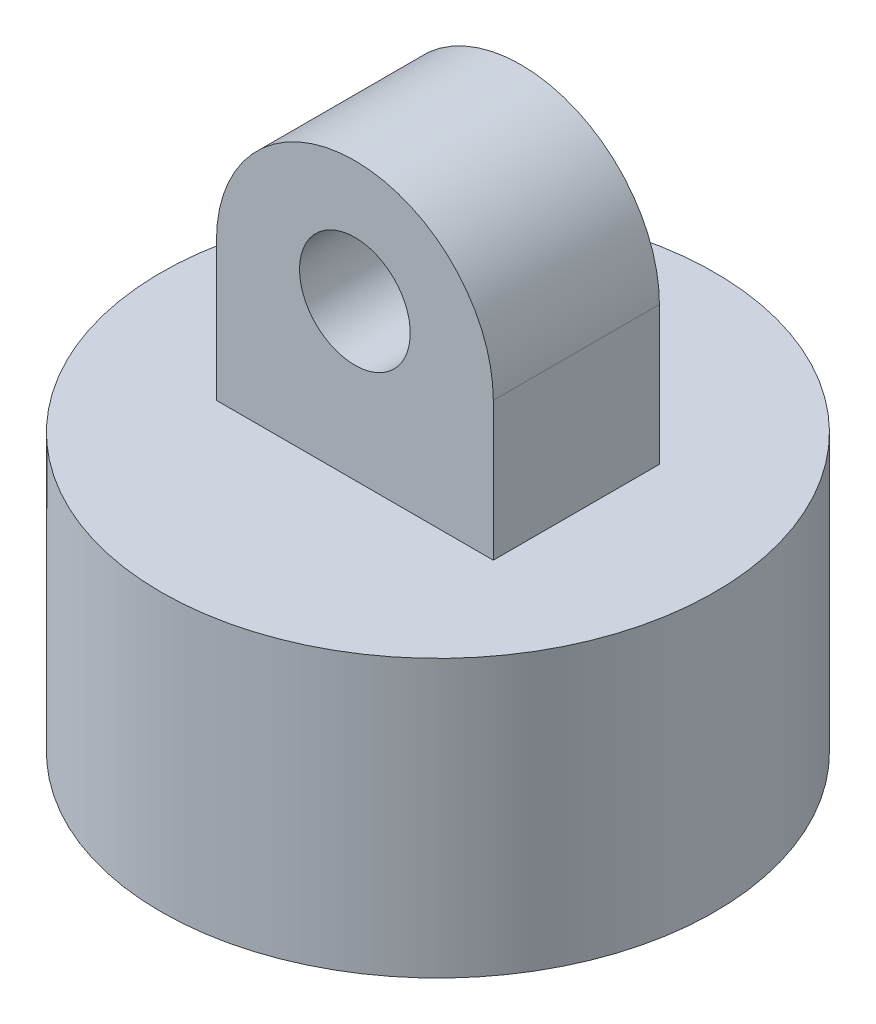
ISO-10303-21;
HEADER;
FILE_DESCRIPTION(('STEP AP214'),'2;1');
FILE_NAME('part.step','',(''),(''),'','','');
FILE_SCHEMA(('AUTOMOTIVE_DESIGN { 1 0 10303 214 1 1 1 1 }'));
ENDSEC;
DATA;
#1=APPLICATION_CONTEXT('core data for automotive mechanical design processes');
#2=APPLICATION_PROTOCOL_DEFINITION('international standard','automotive_design',2000,#1);
#3=PRODUCT_CONTEXT('',#1,'mechanical');
#4=PRODUCT('Part','Part','',(#3));
#5=PRODUCT_RELATED_PRODUCT_CATEGORY('part','',(#4));
#6=PRODUCT_DEFINITION_FORMATION('','',#4);
#7=PRODUCT_DEFINITION_CONTEXT('part definition',#1,'design');
#8=PRODUCT_DEFINITION('design','',#6,#7);
#9=PRODUCT_DEFINITION_SHAPE('','',#8);
#10=(LENGTH_UNIT() NAMED_UNIT(*) SI_UNIT(.MILLI.,.METRE.));
#11=(NAMED_UNIT(*) PLANE_ANGLE_UNIT() SI_UNIT($,.RADIAN.));
#12=(NAMED_UNIT(*) SI_UNIT($,.STERADIAN.) SOLID_ANGLE_UNIT());
#13=UNCERTAINTY_MEASURE_WITH_UNIT(LENGTH_MEASURE(1.E-05),#10,'distance_accuracy_value','');
#14=(GEOMETRIC_REPRESENTATION_CONTEXT(3) GLOBAL_UNCERTAINTY_ASSIGNED_CONTEXT((#13)) GLOBAL_UNIT_ASSIGNED_CONTEXT((#10,
#11,#12)) REPRESENTATION_CONTEXT('',''));
#15=CARTESIAN_POINT('',(0.,0.,0.));
#16=DIRECTION('',(0.,0.,1.));
#17=DIRECTION('',(1.,0.,0.));
#18=AXIS2_PLACEMENT_3D('',#15,#16,#17);
#19=CARTESIAN_POINT('',(0.,75.,15.));
#20=DIRECTION('',(0.,0.,1.));
#21=DIRECTION('',(1.,0.,0.));
#22=AXIS2_PLACEMENT_3D('',#19,#20,#21);
#23=CYLINDRICAL_SURFACE('',#22,25.);
#24=DIRECTION('',(0.,0.,-1.));
#25=VECTOR('',#24,1.);
#26=CARTESIAN_POINT('',(-25.,75.,15.));
#27=LINE('',#26,#25);
#28=CARTESIAN_POINT('',(-25.,75.,15.));
#29=VERTEX_POINT('',#28);
#30=CARTESIAN_POINT('',(-25.,75.,-15.));
#31=VERTEX_POINT('',#30);
#32=EDGE_CURVE('E128',#29,#31,#27,.T.);
#33=ORIENTED_EDGE('',*,*,#32,.F.);
#34=CARTESIAN_POINT('',(0.,75.,15.));
#35=DIRECTION('',(0.,0.,-1.));
#36=DIRECTION('',(-1.,0.,0.));
#37=AXIS2_PLACEMENT_3D('',#34,#35,#36);
#38=CIRCLE('',#37,25.);
#39=CARTESIAN_POINT('',(25.,75.,15.));
#40=VERTEX_POINT('',#39);
#41=EDGE_CURVE('E50',#40,#29,#38,.F.);
#42=ORIENTED_EDGE('',*,*,#41,.F.);
#43=DIRECTION('',(0.,0.,-1.));
#44=VECTOR('',#43,1.);
#45=CARTESIAN_POINT('',(25.,75.,15.));
#46=LINE('',#45,#44);
#47=CARTESIAN_POINT('',(25.,75.,-15.));
#48=VERTEX_POINT('',#47);
#49=EDGE_CURVE('E85',#48,#40,#46,.F.);
#50=ORIENTED_EDGE('',*,*,#49,.F.);
#51=CARTESIAN_POINT('',(0.,75.,-15.));
#52=DIRECTION('',(0.,0.,1.));
#53=DIRECTION('',(1.,0.,0.));
#54=AXIS2_PLACEMENT_3D('',#51,#52,#53);
#55=CIRCLE('',#54,25.);
#56=EDGE_CURVE('E11',#31,#48,#55,.F.);
#57=ORIENTED_EDGE('',*,*,#56,.F.);
#58=EDGE_LOOP('',(#33,#42,#50,#57));
#59=FACE_BOUND('',#58,.T.);
#60=ADVANCED_FACE('F41',(#59),#23,.T.);
#61=CARTESIAN_POINT('',(0.,50.,0.));
#62=DIRECTION('',(0.,-1.,0.));
#63=DIRECTION('',(0.,0.,-1.));
#64=AXIS2_PLACEMENT_3D('',#61,#62,#63);
#65=CYLINDRICAL_SURFACE('',#64,50.);
#66=CARTESIAN_POINT('',(0.,50.,0.));
#67=DIRECTION('',(0.,1.,0.));
#68=DIRECTION('',(0.,0.,1.));
#69=AXIS2_PLACEMENT_3D('',#66,#67,#68);
#70=CIRCLE('',#69,50.);
#71=CARTESIAN_POINT('',(0.,50.,50.));
#72=VERTEX_POINT('',#71);
#73=EDGE_CURVE('E124',#72,#72,#70,.T.);
#74=ORIENTED_EDGE('',*,*,#73,.F.);
#75=EDGE_LOOP('',(#74));
#76=FACE_BOUND('',#75,.T.);
#77=CARTESIAN_POINT('',(0.,0.,0.));
#78=DIRECTION('',(0.,1.,0.));
#79=DIRECTION('',(0.,0.,1.));
#80=AXIS2_PLACEMENT_3D('',#77,#78,#79);
#81=CIRCLE('',#80,50.);
#82=CARTESIAN_POINT('',(0.,0.,50.));
#83=VERTEX_POINT('',#82);
#84=EDGE_CURVE('E123',#83,#83,#81,.T.);
#85=ORIENTED_EDGE('',*,*,#84,.T.);
#86=EDGE_LOOP('',(#85));
#87=FACE_BOUND('',#86,.T.);
#88=ADVANCED_FACE('F153',(#76,#87),#65,.T.);
#89=CARTESIAN_POINT('',(0.,50.,0.));
#90=DIRECTION('',(0.,1.,0.));
#91=DIRECTION('',(0.,0.,1.));
#92=AXIS2_PLACEMENT_3D('',#89,#90,#91);
#93=PLANE('',#92);
#94=DIRECTION('',(0.,0.,1.));
#95=VECTOR('',#94,1.);
#96=CARTESIAN_POINT('',(-25.,50.,-15.));
#97=LINE('',#96,#95);
#98=CARTESIAN_POINT('',(-25.,50.,-15.));
#99=VERTEX_POINT('',#98);
#100=CARTESIAN_POINT('',(-25.,50.,15.));
#101=VERTEX_POINT('',#100);
#102=EDGE_CURVE('E107',#99,#101,#97,.T.);
#103=ORIENTED_EDGE('',*,*,#102,.F.);
#104=DIRECTION('',(-1.,0.,0.));
#105=VECTOR('',#104,1.);
#106=CARTESIAN_POINT('',(-25.,50.,-15.));
#107=LINE('',#106,#105);
#108=CARTESIAN_POINT('',(25.,50.,-15.));
#109=VERTEX_POINT('',#108);
#110=EDGE_CURVE('E101',#109,#99,#107,.T.);
#111=ORIENTED_EDGE('',*,*,#110,.F.);
#112=DIRECTION('',(0.,0.,-1.));
#113=VECTOR('',#112,1.);
#114=CARTESIAN_POINT('',(25.,50.,-15.));
#115=LINE('',#114,#113);
#116=CARTESIAN_POINT('',(25.,50.,15.));
#117=VERTEX_POINT('',#116);
#118=EDGE_CURVE('E84',#117,#109,#115,.T.);
#119=ORIENTED_EDGE('',*,*,#118,.F.);
#120=DIRECTION('',(1.,0.,0.));
#121=VECTOR('',#120,1.);
#122=CARTESIAN_POINT('',(-25.,50.,15.));
#123=LINE('',#122,#121);
#124=EDGE_CURVE('E98',#101,#117,#123,.T.);
#125=ORIENTED_EDGE('',*,*,#124,.F.);
#126=EDGE_LOOP('',(#103,#111,#119,#125));
#127=FACE_BOUND('',#126,.T.);
#128=ORIENTED_EDGE('',*,*,#73,.T.);
#129=EDGE_LOOP('',(#128));
#130=FACE_BOUND('',#129,.T.);
#131=ADVANCED_FACE('F96',(#127,#130),#93,.T.);
#132=CARTESIAN_POINT('',(0.,0.,0.));
#133=DIRECTION('',(0.,1.,0.));
#134=DIRECTION('',(0.,0.,1.));
#135=AXIS2_PLACEMENT_3D('',#132,#133,#134);
#136=PLANE('',#135);
#137=ORIENTED_EDGE('',*,*,#84,.F.);
#138=EDGE_LOOP('',(#137));
#139=FACE_BOUND('',#138,.T.);
#140=ADVANCED_FACE('F161',(#139),#136,.F.);
#141=CARTESIAN_POINT('',(-25.,100.,-15.));
#142=DIRECTION('',(1.,0.,0.));
#143=DIRECTION('',(0.,0.,-1.));
#144=AXIS2_PLACEMENT_3D('',#141,#142,#143);
#145=PLANE('',#144);
#146=DIRECTION('',(0.,-1.,0.));
#147=VECTOR('',#146,1.);
#148=CARTESIAN_POINT('',(-25.,100.,15.));
#149=LINE('',#148,#147);
#150=EDGE_CURVE('E89',#29,#101,#149,.T.);
#151=ORIENTED_EDGE('',*,*,#150,.F.);
#152=ORIENTED_EDGE('',*,*,#32,.T.);
#153=DIRECTION('',(0.,-1.,0.));
#154=VECTOR('',#153,1.);
#155=CARTESIAN_POINT('',(-25.,100.,-15.));
#156=LINE('',#155,#154);
#157=EDGE_CURVE('E116',#31,#99,#156,.T.);
#158=ORIENTED_EDGE('',*,*,#157,.T.);
#159=ORIENTED_EDGE('',*,*,#102,.T.);
#160=EDGE_LOOP('',(#151,#152,#158,#159));
#161=FACE_BOUND('',#160,.T.);
#162=ADVANCED_FACE('F138',(#161),#145,.F.);
#163=CARTESIAN_POINT('',(-25.,100.,15.));
#164=DIRECTION('',(0.,0.,-1.));
#165=DIRECTION('',(-1.,0.,0.));
#166=AXIS2_PLACEMENT_3D('',#163,#164,#165);
#167=PLANE('',#166);
#168=CARTESIAN_POINT('',(0.,78.,15.));
#169=DIRECTION('',(0.,0.,-1.));
#170=DIRECTION('',(-1.,0.,0.));
#171=AXIS2_PLACEMENT_3D('',#168,#169,#170);
#172=CIRCLE('',#171,10.);
#173=CARTESIAN_POINT('',(-10.,78.,15.));
#174=VERTEX_POINT('',#173);
#175=EDGE_CURVE('E110',#174,#174,#172,.T.);
#176=ORIENTED_EDGE('',*,*,#175,.T.);
#177=EDGE_LOOP('',(#176));
#178=FACE_BOUND('',#177,.T.);
#179=DIRECTION('',(0.,-1.,0.));
#180=VECTOR('',#179,1.);
#181=CARTESIAN_POINT('',(25.,100.,15.));
#182=LINE('',#181,#180);
#183=EDGE_CURVE('E80',#40,#117,#182,.T.);
#184=ORIENTED_EDGE('',*,*,#183,.F.);
#185=ORIENTED_EDGE('',*,*,#41,.T.);
#186=ORIENTED_EDGE('',*,*,#150,.T.);
#187=ORIENTED_EDGE('',*,*,#124,.T.);
#188=EDGE_LOOP('',(#184,#185,#186,#187));
#189=FACE_BOUND('',#188,.T.);
#190=ADVANCED_FACE('F104',(#178,#189),#167,.F.);
#191=CARTESIAN_POINT('',(25.,100.,-15.));
#192=DIRECTION('',(-1.,0.,0.));
#193=DIRECTION('',(0.,0.,1.));
#194=AXIS2_PLACEMENT_3D('',#191,#192,#193);
#195=PLANE('',#194);
#196=DIRECTION('',(0.,-1.,0.));
#197=VECTOR('',#196,1.);
#198=CARTESIAN_POINT('',(25.,100.,-15.));
#199=LINE('',#198,#197);
#200=EDGE_CURVE('E90',#48,#109,#199,.T.);
#201=ORIENTED_EDGE('',*,*,#200,.F.);
#202=ORIENTED_EDGE('',*,*,#49,.T.);
#203=ORIENTED_EDGE('',*,*,#183,.T.);
#204=ORIENTED_EDGE('',*,*,#118,.T.);
#205=EDGE_LOOP('',(#201,#202,#203,#204));
#206=FACE_BOUND('',#205,.T.);
#207=ADVANCED_FACE('F83',(#206),#195,.F.);
#208=CARTESIAN_POINT('',(-25.,100.,-15.));
#209=DIRECTION('',(0.,0.,1.));
#210=DIRECTION('',(1.,0.,0.));
#211=AXIS2_PLACEMENT_3D('',#208,#209,#210);
#212=PLANE('',#211);
#213=CARTESIAN_POINT('',(0.,78.,-15.));
#214=DIRECTION('',(0.,0.,-1.));
#215=DIRECTION('',(-1.,0.,0.));
#216=AXIS2_PLACEMENT_3D('',#213,#214,#215);
#217=CIRCLE('',#216,10.);
#218=CARTESIAN_POINT('',(-10.,78.,-15.));
#219=VERTEX_POINT('',#218);
#220=EDGE_CURVE('E178',#219,#219,#217,.T.);
#221=ORIENTED_EDGE('',*,*,#220,.F.);
#222=EDGE_LOOP('',(#221));
#223=FACE_BOUND('',#222,.T.);
#224=ORIENTED_EDGE('',*,*,#157,.F.);
#225=ORIENTED_EDGE('',*,*,#56,.T.);
#226=ORIENTED_EDGE('',*,*,#200,.T.);
#227=ORIENTED_EDGE('',*,*,#110,.T.);
#228=EDGE_LOOP('',(#224,#225,#226,#227));
#229=FACE_BOUND('',#228,.T.);
#230=ADVANCED_FACE('F139',(#223,#229),#212,.F.);
#231=CARTESIAN_POINT('',(0.,78.,15.));
#232=DIRECTION('',(0.,0.,-1.));
#233=DIRECTION('',(-1.,0.,0.));
#234=AXIS2_PLACEMENT_3D('',#231,#232,#233);
#235=CYLINDRICAL_SURFACE('',#234,10.);
#236=ORIENTED_EDGE('',*,*,#175,.F.);
#237=EDGE_LOOP('',(#236));
#238=FACE_BOUND('',#237,.T.);
#239=ORIENTED_EDGE('',*,*,#220,.T.);
#240=EDGE_LOOP('',(#239));
#241=FACE_BOUND('',#240,.T.);
#242=ADVANCED_FACE('F141',(#238,#241),#235,.F.);
#243=CLOSED_SHELL('',(#60,#88,#131,#140,#162,#190,#207,#230,#242));
#244=MANIFOLD_SOLID_BREP('B2',#243);
#245=ADVANCED_BREP_SHAPE_REPRESENTATION('',(#18,#244),#14);
#246=SHAPE_DEFINITION_REPRESENTATION(#9,#245);
ENDSEC;
END-ISO-10303-21;
